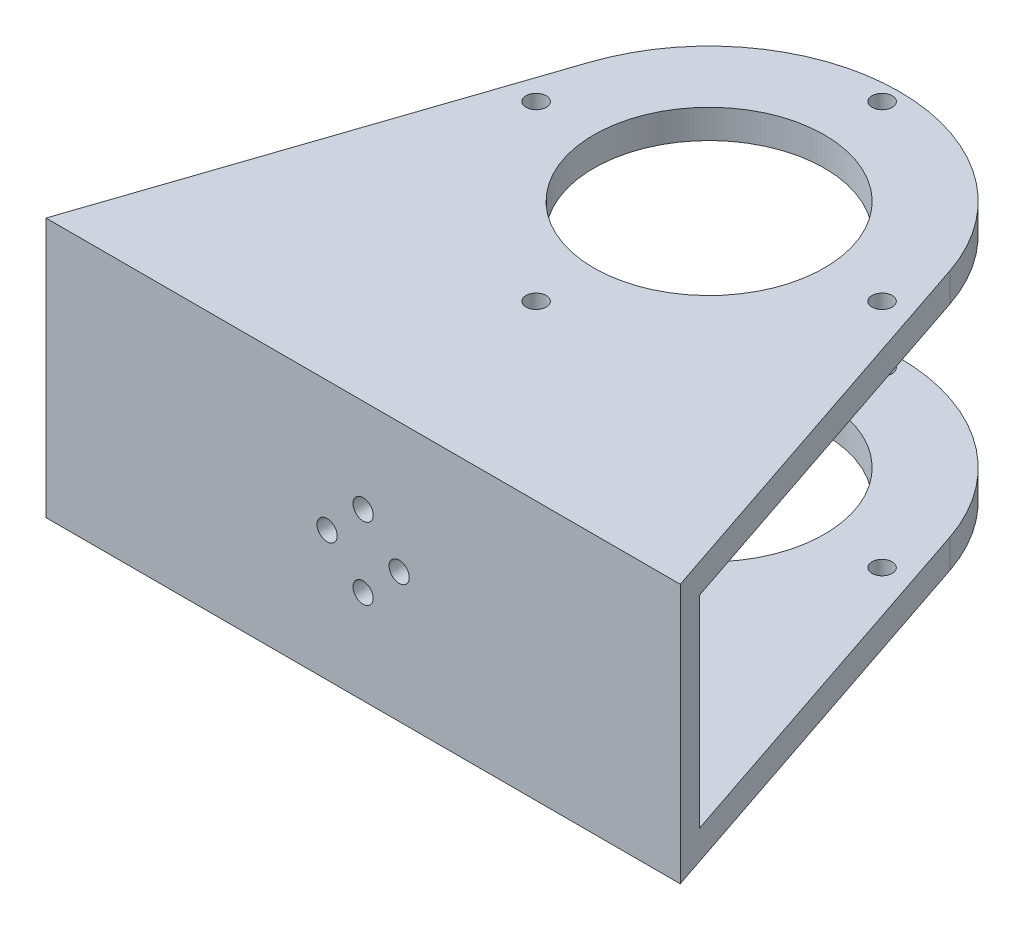
ISO-10303-21;
HEADER;
FILE_DESCRIPTION(('STEP AP214'),'2;1');
FILE_NAME('part.step','',(''),(''),'','','');
FILE_SCHEMA(('AUTOMOTIVE_DESIGN { 1 0 10303 214 1 1 1 1 }'));
ENDSEC;
DATA;
#1=APPLICATION_CONTEXT('core data for automotive mechanical design processes');
#2=APPLICATION_PROTOCOL_DEFINITION('international standard','automotive_design',2000,#1);
#3=PRODUCT_CONTEXT('',#1,'mechanical');
#4=PRODUCT('Part','Part','',(#3));
#5=PRODUCT_RELATED_PRODUCT_CATEGORY('part','',(#4));
#6=PRODUCT_DEFINITION_FORMATION('','',#4);
#7=PRODUCT_DEFINITION_CONTEXT('part definition',#1,'design');
#8=PRODUCT_DEFINITION('design','',#6,#7);
#9=PRODUCT_DEFINITION_SHAPE('','',#8);
#10=(LENGTH_UNIT() NAMED_UNIT(*) SI_UNIT(.MILLI.,.METRE.));
#11=(NAMED_UNIT(*) PLANE_ANGLE_UNIT() SI_UNIT($,.RADIAN.));
#12=(NAMED_UNIT(*) SI_UNIT($,.STERADIAN.) SOLID_ANGLE_UNIT());
#13=UNCERTAINTY_MEASURE_WITH_UNIT(LENGTH_MEASURE(1.E-05),#10,'distance_accuracy_value','');
#14=(GEOMETRIC_REPRESENTATION_CONTEXT(3) GLOBAL_UNCERTAINTY_ASSIGNED_CONTEXT((#13)) GLOBAL_UNIT_ASSIGNED_CONTEXT((#10,
#11,#12)) REPRESENTATION_CONTEXT('',''));
#15=CARTESIAN_POINT('',(0.,0.,0.));
#16=DIRECTION('',(0.,0.,1.));
#17=DIRECTION('',(1.,0.,0.));
#18=AXIS2_PLACEMENT_3D('',#15,#16,#17);
#19=CARTESIAN_POINT('',(0.,57.15,0.));
#20=DIRECTION('',(0.,-1.,0.));
#21=DIRECTION('',(0.,0.,-1.));
#22=AXIS2_PLACEMENT_3D('',#19,#20,#21);
#23=CYLINDRICAL_SURFACE('',#22,41.91);
#24=CARTESIAN_POINT('',(0.,50.8,0.));
#25=DIRECTION('',(0.,-1.,0.));
#26=DIRECTION('',(0.,0.,-1.));
#27=AXIS2_PLACEMENT_3D('',#24,#25,#26);
#28=CIRCLE('',#27,41.91);
#29=CARTESIAN_POINT('',(-39.722823422078,50.8,-13.3620881369049));
#30=VERTEX_POINT('',#29);
#31=CARTESIAN_POINT('',(39.722823422078,50.8,-13.3620881369049));
#32=VERTEX_POINT('',#31);
#33=EDGE_CURVE('E129',#30,#32,#28,.T.);
#34=ORIENTED_EDGE('',*,*,#33,.F.);
#35=DIRECTION('',(0.,-1.,0.));
#36=VECTOR('',#35,1.);
#37=CARTESIAN_POINT('',(-39.722823422078,57.15,-13.3620881369048));
#38=LINE('',#37,#36);
#39=CARTESIAN_POINT('',(-39.722823422078,57.15,-13.3620881369048));
#40=VERTEX_POINT('',#39);
#41=EDGE_CURVE('E11',#40,#30,#38,.T.);
#42=ORIENTED_EDGE('',*,*,#41,.F.);
#43=CARTESIAN_POINT('',(0.,57.15,0.));
#44=DIRECTION('',(0.,1.,0.));
#45=DIRECTION('',(0.,0.,1.));
#46=AXIS2_PLACEMENT_3D('',#43,#44,#45);
#47=CIRCLE('',#46,41.91);
#48=CARTESIAN_POINT('',(39.722823422078,57.15,-13.3620881369048));
#49=VERTEX_POINT('',#48);
#50=EDGE_CURVE('E207',#49,#40,#47,.T.);
#51=ORIENTED_EDGE('',*,*,#50,.F.);
#52=DIRECTION('',(0.,-1.,0.));
#53=VECTOR('',#52,1.);
#54=CARTESIAN_POINT('',(39.722823422078,57.15,-13.3620881369048));
#55=LINE('',#54,#53);
#56=EDGE_CURVE('E66',#49,#32,#55,.T.);
#57=ORIENTED_EDGE('',*,*,#56,.T.);
#58=EDGE_LOOP('',(#34,#42,#51,#57));
#59=FACE_BOUND('',#58,.T.);
#60=ADVANCED_FACE('F40',(#59),#23,.T.);
#61=CARTESIAN_POINT('',(-39.722823422078,57.15,-13.3620881369048));
#62=DIRECTION('',(0.947812536914292,0.,0.318828158838101));
#63=DIRECTION('',(0.318828158838101,0.,-0.947812536914292));
#64=AXIS2_PLACEMENT_3D('',#61,#62,#63);
#65=PLANE('',#64);
#66=DIRECTION('',(-0.318828158838101,0.,0.947812536914292));
#67=VECTOR('',#66,1.);
#68=CARTESIAN_POINT('',(-78.3659397435693,50.8,101.516190646324));
#69=LINE('',#68,#67);
#70=CARTESIAN_POINT('',(-67.7139670506859,50.8,69.85));
#71=VERTEX_POINT('',#70);
#72=EDGE_CURVE('E142',#30,#71,#69,.T.);
#73=ORIENTED_EDGE('',*,*,#72,.T.);
#74=DIRECTION('',(0.,-1.,0.));
#75=VECTOR('',#74,1.);
#76=CARTESIAN_POINT('',(-67.7139670506859,6.35,69.85));
#77=LINE('',#76,#75);
#78=CARTESIAN_POINT('',(-67.7139670506859,6.35,69.85));
#79=VERTEX_POINT('',#78);
#80=EDGE_CURVE('E121',#71,#79,#77,.T.);
#81=ORIENTED_EDGE('',*,*,#80,.T.);
#82=DIRECTION('',(-0.318828158838101,0.,0.947812536914292));
#83=VECTOR('',#82,1.);
#84=CARTESIAN_POINT('',(-78.3659397435693,6.35,101.516190646324));
#85=LINE('',#84,#83);
#86=CARTESIAN_POINT('',(-39.722823422078,6.35,-13.3620881369049));
#87=VERTEX_POINT('',#86);
#88=EDGE_CURVE('E145',#87,#79,#85,.T.);
#89=ORIENTED_EDGE('',*,*,#88,.F.);
#90=CARTESIAN_POINT('',(-39.722823422078,0.,-13.3620881369048));
#91=VERTEX_POINT('',#90);
#92=EDGE_CURVE('E49',#87,#91,#38,.T.);
#93=ORIENTED_EDGE('',*,*,#92,.T.);
#94=DIRECTION('',(-0.318828158838101,0.,0.947812536914292));
#95=VECTOR('',#94,1.);
#96=CARTESIAN_POINT('',(-39.722823422078,0.,-13.3620881369048));
#97=LINE('',#96,#95);
#98=CARTESIAN_POINT('',(-69.85,0.,76.2));
#99=VERTEX_POINT('',#98);
#100=EDGE_CURVE('E216',#91,#99,#97,.T.);
#101=ORIENTED_EDGE('',*,*,#100,.T.);
#102=DIRECTION('',(0.,-1.,0.));
#103=VECTOR('',#102,1.);
#104=CARTESIAN_POINT('',(-69.85,57.15,76.2));
#105=LINE('',#104,#103);
#106=CARTESIAN_POINT('',(-69.85,57.15,76.2));
#107=VERTEX_POINT('',#106);
#108=EDGE_CURVE('E226',#107,#99,#105,.T.);
#109=ORIENTED_EDGE('',*,*,#108,.F.);
#110=DIRECTION('',(-0.318828158838101,0.,0.947812536914292));
#111=VECTOR('',#110,1.);
#112=CARTESIAN_POINT('',(-39.722823422078,57.15,-13.3620881369048));
#113=LINE('',#112,#111);
#114=EDGE_CURVE('E96',#40,#107,#113,.T.);
#115=ORIENTED_EDGE('',*,*,#114,.F.);
#116=ORIENTED_EDGE('',*,*,#41,.T.);
#117=EDGE_LOOP('',(#73,#81,#89,#93,#101,#109,#115,#116));
#118=FACE_BOUND('',#117,.T.);
#119=ADVANCED_FACE('F245',(#118),#65,.F.);
#120=CARTESIAN_POINT('',(39.722823422078,57.15,-13.3620881369048));
#121=DIRECTION('',(0.947812536914292,0.,-0.318828158838101));
#122=DIRECTION('',(-0.318828158838101,0.,-0.947812536914292));
#123=AXIS2_PLACEMENT_3D('',#120,#121,#122);
#124=PLANE('',#123);
#125=DIRECTION('',(0.,1.,0.));
#126=VECTOR('',#125,1.);
#127=CARTESIAN_POINT('',(67.7139670506859,6.35,69.85));
#128=LINE('',#127,#126);
#129=CARTESIAN_POINT('',(67.7139670506859,6.35,69.85));
#130=VERTEX_POINT('',#129);
#131=CARTESIAN_POINT('',(67.7139670506859,50.8,69.85));
#132=VERTEX_POINT('',#131);
#133=EDGE_CURVE('E57',#130,#132,#128,.T.);
#134=ORIENTED_EDGE('',*,*,#133,.T.);
#135=DIRECTION('',(-0.318828158838101,0.,-0.947812536914292));
#136=VECTOR('',#135,1.);
#137=CARTESIAN_POINT('',(78.3659397435693,50.8,101.516190646324));
#138=LINE('',#137,#136);
#139=EDGE_CURVE('E126',#132,#32,#138,.T.);
#140=ORIENTED_EDGE('',*,*,#139,.T.);
#141=ORIENTED_EDGE('',*,*,#56,.F.);
#142=DIRECTION('',(0.318828158838101,0.,0.947812536914292));
#143=VECTOR('',#142,1.);
#144=CARTESIAN_POINT('',(39.722823422078,57.15,-13.3620881369048));
#145=LINE('',#144,#143);
#146=CARTESIAN_POINT('',(69.85,57.15,76.2));
#147=VERTEX_POINT('',#146);
#148=EDGE_CURVE('E213',#49,#147,#145,.T.);
#149=ORIENTED_EDGE('',*,*,#148,.T.);
#150=DIRECTION('',(0.,-1.,0.));
#151=VECTOR('',#150,1.);
#152=CARTESIAN_POINT('',(69.85,57.15,76.2));
#153=LINE('',#152,#151);
#154=CARTESIAN_POINT('',(69.85,0.,76.2));
#155=VERTEX_POINT('',#154);
#156=EDGE_CURVE('E224',#147,#155,#153,.T.);
#157=ORIENTED_EDGE('',*,*,#156,.T.);
#158=DIRECTION('',(0.318828158838101,0.,0.947812536914292));
#159=VECTOR('',#158,1.);
#160=CARTESIAN_POINT('',(39.722823422078,0.,-13.3620881369048));
#161=LINE('',#160,#159);
#162=CARTESIAN_POINT('',(39.722823422078,0.,-13.3620881369048));
#163=VERTEX_POINT('',#162);
#164=EDGE_CURVE('E209',#163,#155,#161,.T.);
#165=ORIENTED_EDGE('',*,*,#164,.F.);
#166=CARTESIAN_POINT('',(39.722823422078,6.35,-13.3620881369049));
#167=VERTEX_POINT('',#166);
#168=EDGE_CURVE('E89',#167,#163,#55,.T.);
#169=ORIENTED_EDGE('',*,*,#168,.F.);
#170=DIRECTION('',(-0.318828158838101,0.,-0.947812536914292));
#171=VECTOR('',#170,1.);
#172=CARTESIAN_POINT('',(78.3659397435693,6.35,101.516190646324));
#173=LINE('',#172,#171);
#174=EDGE_CURVE('E134',#130,#167,#173,.T.);
#175=ORIENTED_EDGE('',*,*,#174,.F.);
#176=EDGE_LOOP('',(#134,#140,#141,#149,#157,#165,#169,#175));
#177=FACE_BOUND('',#176,.T.);
#178=ADVANCED_FACE('F132',(#177),#124,.T.);
#179=CARTESIAN_POINT('',(0.,-71.8420489685532,0.));
#180=DIRECTION('',(0.,1.,0.));
#181=DIRECTION('',(0.,0.,1.));
#182=AXIS2_PLACEMENT_3D('',#179,#180,#181);
#183=CYLINDRICAL_SURFACE('',#182,25.4);
#184=CARTESIAN_POINT('',(0.,57.15,0.));
#185=DIRECTION('',(0.,1.,0.));
#186=DIRECTION('',(0.,0.,1.));
#187=AXIS2_PLACEMENT_3D('',#184,#185,#186);
#188=CIRCLE('',#187,25.4);
#189=CARTESIAN_POINT('',(0.,57.15,25.4));
#190=VERTEX_POINT('',#189);
#191=EDGE_CURVE('E200',#190,#190,#188,.T.);
#192=ORIENTED_EDGE('',*,*,#191,.T.);
#193=EDGE_LOOP('',(#192));
#194=FACE_BOUND('',#193,.T.);
#195=CARTESIAN_POINT('',(0.,50.8,0.));
#196=DIRECTION('',(0.,-1.,0.));
#197=DIRECTION('',(0.,0.,-1.));
#198=AXIS2_PLACEMENT_3D('',#195,#196,#197);
#199=CIRCLE('',#198,25.4);
#200=CARTESIAN_POINT('',(0.,50.8,-25.4));
#201=VERTEX_POINT('',#200);
#202=EDGE_CURVE('E172',#201,#201,#199,.F.);
#203=ORIENTED_EDGE('',*,*,#202,.F.);
#204=EDGE_LOOP('',(#203));
#205=FACE_BOUND('',#204,.T.);
#206=ADVANCED_FACE('F309',(#194,#205),#183,.F.);
#207=CARTESIAN_POINT('',(0.,-6.28617928474841,-38.1));
#208=DIRECTION('',(0.,1.,0.));
#209=DIRECTION('',(0.,0.,1.));
#210=AXIS2_PLACEMENT_3D('',#207,#208,#209);
#211=CYLINDRICAL_SURFACE('',#210,2.2225);
#212=CARTESIAN_POINT('',(0.,57.15,-38.1));
#213=DIRECTION('',(0.,1.,0.));
#214=DIRECTION('',(0.,0.,1.));
#215=AXIS2_PLACEMENT_3D('',#212,#213,#214);
#216=CIRCLE('',#215,2.2225);
#217=CARTESIAN_POINT('',(0.,57.15,-35.8775));
#218=VERTEX_POINT('',#217);
#219=EDGE_CURVE('E184',#218,#218,#216,.T.);
#220=ORIENTED_EDGE('',*,*,#219,.T.);
#221=EDGE_LOOP('',(#220));
#222=FACE_BOUND('',#221,.T.);
#223=CARTESIAN_POINT('',(0.,50.8,-38.1));
#224=DIRECTION('',(0.,-1.,0.));
#225=DIRECTION('',(0.,0.,-1.));
#226=AXIS2_PLACEMENT_3D('',#223,#224,#225);
#227=CIRCLE('',#226,2.2225);
#228=CARTESIAN_POINT('',(0.,50.8,-40.3225));
#229=VERTEX_POINT('',#228);
#230=EDGE_CURVE('E169',#229,#229,#227,.F.);
#231=ORIENTED_EDGE('',*,*,#230,.F.);
#232=EDGE_LOOP('',(#231));
#233=FACE_BOUND('',#232,.T.);
#234=ADVANCED_FACE('F306',(#222,#233),#211,.F.);
#235=CARTESIAN_POINT('',(38.1,-6.28617928474841,-3.9907631702977E-13));
#236=DIRECTION('',(0.,1.,0.));
#237=DIRECTION('',(0.,0.,1.));
#238=AXIS2_PLACEMENT_3D('',#235,#236,#237);
#239=CYLINDRICAL_SURFACE('',#238,2.2225);
#240=CARTESIAN_POINT('',(38.1,57.15,-3.9907631702977E-13));
#241=DIRECTION('',(0.,1.,0.));
#242=DIRECTION('',(-1.,0.,0.));
#243=AXIS2_PLACEMENT_3D('',#240,#241,#242);
#244=CIRCLE('',#243,2.2225);
#245=CARTESIAN_POINT('',(35.8775,57.15,-3.75796865203034E-13));
#246=VERTEX_POINT('',#245);
#247=EDGE_CURVE('E176',#246,#246,#244,.T.);
#248=ORIENTED_EDGE('',*,*,#247,.T.);
#249=EDGE_LOOP('',(#248));
#250=FACE_BOUND('',#249,.T.);
#251=CARTESIAN_POINT('',(38.1,50.8,-3.9907631702977E-13));
#252=DIRECTION('',(0.,-1.,0.));
#253=DIRECTION('',(0.,0.,-1.));
#254=AXIS2_PLACEMENT_3D('',#251,#252,#253);
#255=CIRCLE('',#254,2.2225);
#256=CARTESIAN_POINT('',(38.1,50.8,-2.2225000000004));
#257=VERTEX_POINT('',#256);
#258=EDGE_CURVE('E166',#257,#257,#255,.F.);
#259=ORIENTED_EDGE('',*,*,#258,.F.);
#260=EDGE_LOOP('',(#259));
#261=FACE_BOUND('',#260,.T.);
#262=ADVANCED_FACE('F280',(#250,#261),#239,.F.);
#263=CARTESIAN_POINT('',(0.,-6.28617928474841,38.1));
#264=DIRECTION('',(0.,1.,0.));
#265=DIRECTION('',(0.,0.,1.));
#266=AXIS2_PLACEMENT_3D('',#263,#264,#265);
#267=CYLINDRICAL_SURFACE('',#266,2.2225);
#268=CARTESIAN_POINT('',(0.,57.15,38.1));
#269=DIRECTION('',(0.,1.,0.));
#270=DIRECTION('',(0.,0.,-1.));
#271=AXIS2_PLACEMENT_3D('',#268,#269,#270);
#272=CIRCLE('',#271,2.2225);
#273=CARTESIAN_POINT('',(0.,57.15,35.8775));
#274=VERTEX_POINT('',#273);
#275=EDGE_CURVE('E185',#274,#274,#272,.T.);
#276=ORIENTED_EDGE('',*,*,#275,.T.);
#277=EDGE_LOOP('',(#276));
#278=FACE_BOUND('',#277,.T.);
#279=CARTESIAN_POINT('',(0.,50.8,38.1));
#280=DIRECTION('',(0.,-1.,0.));
#281=DIRECTION('',(0.,0.,-1.));
#282=AXIS2_PLACEMENT_3D('',#279,#280,#281);
#283=CIRCLE('',#282,2.2225);
#284=CARTESIAN_POINT('',(0.,50.8,35.8775));
#285=VERTEX_POINT('',#284);
#286=EDGE_CURVE('E163',#285,#285,#283,.F.);
#287=ORIENTED_EDGE('',*,*,#286,.F.);
#288=EDGE_LOOP('',(#287));
#289=FACE_BOUND('',#288,.T.);
#290=ADVANCED_FACE('F274',(#278,#289),#267,.F.);
#291=CARTESIAN_POINT('',(-38.1,-6.28617928474841,1.33025439009923E-13));
#292=DIRECTION('',(0.,1.,0.));
#293=DIRECTION('',(0.,0.,1.));
#294=AXIS2_PLACEMENT_3D('',#291,#292,#293);
#295=CYLINDRICAL_SURFACE('',#294,2.2225);
#296=CARTESIAN_POINT('',(-38.1,57.15,1.33025439009923E-13));
#297=DIRECTION('',(0.,1.,0.));
#298=DIRECTION('',(1.,0.,0.));
#299=AXIS2_PLACEMENT_3D('',#296,#297,#298);
#300=CIRCLE('',#299,2.2225);
#301=CARTESIAN_POINT('',(-35.8775,57.15,1.25265621734345E-13));
#302=VERTEX_POINT('',#301);
#303=EDGE_CURVE('E177',#302,#302,#300,.T.);
#304=ORIENTED_EDGE('',*,*,#303,.T.);
#305=EDGE_LOOP('',(#304));
#306=FACE_BOUND('',#305,.T.);
#307=CARTESIAN_POINT('',(-38.1,50.8,1.33025439009923E-13));
#308=DIRECTION('',(0.,-1.,0.));
#309=DIRECTION('',(0.,0.,-1.));
#310=AXIS2_PLACEMENT_3D('',#307,#308,#309);
#311=CIRCLE('',#310,2.2225);
#312=CARTESIAN_POINT('',(-38.1,50.8,-2.22249999999987));
#313=VERTEX_POINT('',#312);
#314=EDGE_CURVE('E44',#313,#313,#311,.F.);
#315=ORIENTED_EDGE('',*,*,#314,.F.);
#316=EDGE_LOOP('',(#315));
#317=FACE_BOUND('',#316,.T.);
#318=ADVANCED_FACE('F266',(#306,#317),#295,.F.);
#319=CARTESIAN_POINT('',(0.,6.35,0.));
#320=DIRECTION('',(0.,-1.,0.));
#321=DIRECTION('',(0.,0.,-1.));
#322=AXIS2_PLACEMENT_3D('',#319,#320,#321);
#323=CIRCLE('',#322,41.91);
#324=EDGE_CURVE('E161',#87,#167,#323,.T.);
#325=ORIENTED_EDGE('',*,*,#324,.T.);
#326=ORIENTED_EDGE('',*,*,#168,.T.);
#327=CARTESIAN_POINT('',(0.,0.,0.));
#328=DIRECTION('',(0.,1.,0.));
#329=DIRECTION('',(0.,0.,1.));
#330=AXIS2_PLACEMENT_3D('',#327,#328,#329);
#331=CIRCLE('',#330,41.91);
#332=EDGE_CURVE('E206',#163,#91,#331,.T.);
#333=ORIENTED_EDGE('',*,*,#332,.T.);
#334=ORIENTED_EDGE('',*,*,#92,.F.);
#335=EDGE_LOOP('',(#325,#326,#333,#334));
#336=FACE_BOUND('',#335,.T.);
#337=ADVANCED_FACE('F42',(#336),#23,.T.);
#338=CARTESIAN_POINT('',(-69.85,57.15,76.2));
#339=DIRECTION('',(0.,0.,-1.));
#340=DIRECTION('',(-1.,0.,0.));
#341=AXIS2_PLACEMENT_3D('',#338,#339,#340);
#342=PLANE('',#341);
#343=CARTESIAN_POINT('',(0.,36.5125,76.2));
#344=DIRECTION('',(0.,0.,1.));
#345=DIRECTION('',(1.,0.,0.));
#346=AXIS2_PLACEMENT_3D('',#343,#344,#345);
#347=CIRCLE('',#346,2.2225);
#348=CARTESIAN_POINT('',(2.2225,36.5125,76.2));
#349=VERTEX_POINT('',#348);
#350=EDGE_CURVE('E493',#349,#349,#347,.T.);
#351=ORIENTED_EDGE('',*,*,#350,.F.);
#352=EDGE_LOOP('',(#351));
#353=FACE_BOUND('',#352,.T.);
#354=CARTESIAN_POINT('',(-7.9375,28.575,76.2));
#355=DIRECTION('',(0.,0.,1.));
#356=DIRECTION('',(1.,0.,0.));
#357=AXIS2_PLACEMENT_3D('',#354,#355,#356);
#358=CIRCLE('',#357,2.2225);
#359=CARTESIAN_POINT('',(-5.715,28.575,76.2));
#360=VERTEX_POINT('',#359);
#361=EDGE_CURVE('E500',#360,#360,#358,.T.);
#362=ORIENTED_EDGE('',*,*,#361,.F.);
#363=EDGE_LOOP('',(#362));
#364=FACE_BOUND('',#363,.T.);
#365=CARTESIAN_POINT('',(0.,20.6375,76.2));
#366=DIRECTION('',(0.,0.,1.));
#367=DIRECTION('',(1.,0.,0.));
#368=AXIS2_PLACEMENT_3D('',#365,#366,#367);
#369=CIRCLE('',#368,2.2225);
#370=CARTESIAN_POINT('',(2.2225,20.6375,76.2));
#371=VERTEX_POINT('',#370);
#372=EDGE_CURVE('E506',#371,#371,#369,.T.);
#373=ORIENTED_EDGE('',*,*,#372,.F.);
#374=EDGE_LOOP('',(#373));
#375=FACE_BOUND('',#374,.T.);
#376=CARTESIAN_POINT('',(7.9375,28.575,76.2));
#377=DIRECTION('',(0.,0.,1.));
#378=DIRECTION('',(1.,0.,0.));
#379=AXIS2_PLACEMENT_3D('',#376,#377,#378);
#380=CIRCLE('',#379,2.2225);
#381=CARTESIAN_POINT('',(10.16,28.575,76.2));
#382=VERTEX_POINT('',#381);
#383=EDGE_CURVE('E510',#382,#382,#380,.T.);
#384=ORIENTED_EDGE('',*,*,#383,.F.);
#385=EDGE_LOOP('',(#384));
#386=FACE_BOUND('',#385,.T.);
#387=DIRECTION('',(1.,0.,0.));
#388=VECTOR('',#387,1.);
#389=CARTESIAN_POINT('',(-69.85,0.,76.2));
#390=LINE('',#389,#388);
#391=EDGE_CURVE('E218',#99,#155,#390,.T.);
#392=ORIENTED_EDGE('',*,*,#391,.T.);
#393=ORIENTED_EDGE('',*,*,#156,.F.);
#394=DIRECTION('',(1.,0.,0.));
#395=VECTOR('',#394,1.);
#396=CARTESIAN_POINT('',(-69.85,57.15,76.2));
#397=LINE('',#396,#395);
#398=EDGE_CURVE('E211',#107,#147,#397,.T.);
#399=ORIENTED_EDGE('',*,*,#398,.F.);
#400=ORIENTED_EDGE('',*,*,#108,.T.);
#401=EDGE_LOOP('',(#392,#393,#399,#400));
#402=FACE_BOUND('',#401,.T.);
#403=ADVANCED_FACE('F255',(#353,#364,#375,#386,#402),#342,.F.);
#404=CARTESIAN_POINT('',(0.,57.15,0.));
#405=DIRECTION('',(0.,1.,0.));
#406=DIRECTION('',(0.,0.,1.));
#407=AXIS2_PLACEMENT_3D('',#404,#405,#406);
#408=PLANE('',#407);
#409=ORIENTED_EDGE('',*,*,#303,.F.);
#410=EDGE_LOOP('',(#409));
#411=FACE_BOUND('',#410,.T.);
#412=ORIENTED_EDGE('',*,*,#275,.F.);
#413=EDGE_LOOP('',(#412));
#414=FACE_BOUND('',#413,.T.);
#415=ORIENTED_EDGE('',*,*,#247,.F.);
#416=EDGE_LOOP('',(#415));
#417=FACE_BOUND('',#416,.T.);
#418=ORIENTED_EDGE('',*,*,#219,.F.);
#419=EDGE_LOOP('',(#418));
#420=FACE_BOUND('',#419,.T.);
#421=ORIENTED_EDGE('',*,*,#191,.F.);
#422=EDGE_LOOP('',(#421));
#423=FACE_BOUND('',#422,.T.);
#424=ORIENTED_EDGE('',*,*,#50,.T.);
#425=ORIENTED_EDGE('',*,*,#114,.T.);
#426=ORIENTED_EDGE('',*,*,#398,.T.);
#427=ORIENTED_EDGE('',*,*,#148,.F.);
#428=EDGE_LOOP('',(#424,#425,#426,#427));
#429=FACE_BOUND('',#428,.T.);
#430=ADVANCED_FACE('F257',(#411,#414,#417,#420,#423,#429),#408,.T.);
#431=CARTESIAN_POINT('',(0.,0.,0.));
#432=DIRECTION('',(0.,1.,0.));
#433=DIRECTION('',(0.,0.,1.));
#434=AXIS2_PLACEMENT_3D('',#431,#432,#433);
#435=PLANE('',#434);
#436=CARTESIAN_POINT('',(-38.1,0.,1.33025439009923E-13));
#437=DIRECTION('',(0.,1.,0.));
#438=DIRECTION('',(0.,0.,1.));
#439=AXIS2_PLACEMENT_3D('',#436,#437,#438);
#440=CIRCLE('',#439,2.2225);
#441=CARTESIAN_POINT('',(-38.1,0.,2.22250000000013));
#442=VERTEX_POINT('',#441);
#443=EDGE_CURVE('E180',#442,#442,#440,.F.);
#444=ORIENTED_EDGE('',*,*,#443,.F.);
#445=EDGE_LOOP('',(#444));
#446=FACE_BOUND('',#445,.T.);
#447=CARTESIAN_POINT('',(0.,0.,38.1));
#448=DIRECTION('',(0.,1.,0.));
#449=DIRECTION('',(0.,0.,1.));
#450=AXIS2_PLACEMENT_3D('',#447,#448,#449);
#451=CIRCLE('',#450,2.2225);
#452=CARTESIAN_POINT('',(0.,0.,40.3225));
#453=VERTEX_POINT('',#452);
#454=EDGE_CURVE('E181',#453,#453,#451,.F.);
#455=ORIENTED_EDGE('',*,*,#454,.F.);
#456=EDGE_LOOP('',(#455));
#457=FACE_BOUND('',#456,.T.);
#458=CARTESIAN_POINT('',(38.1,0.,-3.9907631702977E-13));
#459=DIRECTION('',(0.,1.,0.));
#460=DIRECTION('',(0.,0.,1.));
#461=AXIS2_PLACEMENT_3D('',#458,#459,#460);
#462=CIRCLE('',#461,2.2225);
#463=CARTESIAN_POINT('',(38.1,0.,2.2224999999996));
#464=VERTEX_POINT('',#463);
#465=EDGE_CURVE('E188',#464,#464,#462,.F.);
#466=ORIENTED_EDGE('',*,*,#465,.F.);
#467=EDGE_LOOP('',(#466));
#468=FACE_BOUND('',#467,.T.);
#469=CARTESIAN_POINT('',(0.,0.,-38.1));
#470=DIRECTION('',(0.,1.,0.));
#471=DIRECTION('',(0.,0.,1.));
#472=AXIS2_PLACEMENT_3D('',#469,#470,#471);
#473=CIRCLE('',#472,2.2225);
#474=CARTESIAN_POINT('',(0.,0.,-35.8775));
#475=VERTEX_POINT('',#474);
#476=EDGE_CURVE('E197',#475,#475,#473,.F.);
#477=ORIENTED_EDGE('',*,*,#476,.F.);
#478=EDGE_LOOP('',(#477));
#479=FACE_BOUND('',#478,.T.);
#480=CARTESIAN_POINT('',(0.,0.,0.));
#481=DIRECTION('',(0.,1.,0.));
#482=DIRECTION('',(0.,0.,1.));
#483=AXIS2_PLACEMENT_3D('',#480,#481,#482);
#484=CIRCLE('',#483,25.4);
#485=CARTESIAN_POINT('',(0.,0.,25.4));
#486=VERTEX_POINT('',#485);
#487=EDGE_CURVE('E203',#486,#486,#484,.F.);
#488=ORIENTED_EDGE('',*,*,#487,.F.);
#489=EDGE_LOOP('',(#488));
#490=FACE_BOUND('',#489,.T.);
#491=ORIENTED_EDGE('',*,*,#332,.F.);
#492=ORIENTED_EDGE('',*,*,#164,.T.);
#493=ORIENTED_EDGE('',*,*,#391,.F.);
#494=ORIENTED_EDGE('',*,*,#100,.F.);
#495=EDGE_LOOP('',(#491,#492,#493,#494));
#496=FACE_BOUND('',#495,.T.);
#497=ADVANCED_FACE('F249',(#446,#457,#468,#479,#490,#496),#435,.F.);
#498=CARTESIAN_POINT('',(0.,6.34999999999999,0.));
#499=DIRECTION('',(0.,-1.,0.));
#500=DIRECTION('',(0.,0.,-1.));
#501=AXIS2_PLACEMENT_3D('',#498,#499,#500);
#502=CIRCLE('',#501,25.4);
#503=CARTESIAN_POINT('',(0.,6.34999999999999,-25.4));
#504=VERTEX_POINT('',#503);
#505=EDGE_CURVE('E158',#504,#504,#502,.F.);
#506=ORIENTED_EDGE('',*,*,#505,.T.);
#507=EDGE_LOOP('',(#506));
#508=FACE_BOUND('',#507,.T.);
#509=ORIENTED_EDGE('',*,*,#487,.T.);
#510=EDGE_LOOP('',(#509));
#511=FACE_BOUND('',#510,.T.);
#512=ADVANCED_FACE('F304',(#508,#511),#183,.F.);
#513=CARTESIAN_POINT('',(0.,6.35,-38.1));
#514=DIRECTION('',(0.,-1.,0.));
#515=DIRECTION('',(0.,0.,-1.));
#516=AXIS2_PLACEMENT_3D('',#513,#514,#515);
#517=CIRCLE('',#516,2.2225);
#518=CARTESIAN_POINT('',(0.,6.35,-40.3225));
#519=VERTEX_POINT('',#518);
#520=EDGE_CURVE('E155',#519,#519,#517,.F.);
#521=ORIENTED_EDGE('',*,*,#520,.T.);
#522=EDGE_LOOP('',(#521));
#523=FACE_BOUND('',#522,.T.);
#524=ORIENTED_EDGE('',*,*,#476,.T.);
#525=EDGE_LOOP('',(#524));
#526=FACE_BOUND('',#525,.T.);
#527=ADVANCED_FACE('F297',(#523,#526),#211,.F.);
#528=CARTESIAN_POINT('',(38.1,6.35,-3.9907631702977E-13));
#529=DIRECTION('',(0.,-1.,0.));
#530=DIRECTION('',(0.,0.,-1.));
#531=AXIS2_PLACEMENT_3D('',#528,#529,#530);
#532=CIRCLE('',#531,2.2225);
#533=CARTESIAN_POINT('',(38.1,6.35,-2.2225000000004));
#534=VERTEX_POINT('',#533);
#535=EDGE_CURVE('E152',#534,#534,#532,.F.);
#536=ORIENTED_EDGE('',*,*,#535,.T.);
#537=EDGE_LOOP('',(#536));
#538=FACE_BOUND('',#537,.T.);
#539=ORIENTED_EDGE('',*,*,#465,.T.);
#540=EDGE_LOOP('',(#539));
#541=FACE_BOUND('',#540,.T.);
#542=ADVANCED_FACE('F292',(#538,#541),#239,.F.);
#543=CARTESIAN_POINT('',(0.,6.35,38.1));
#544=DIRECTION('',(0.,-1.,0.));
#545=DIRECTION('',(0.,0.,-1.));
#546=AXIS2_PLACEMENT_3D('',#543,#544,#545);
#547=CIRCLE('',#546,2.2225);
#548=CARTESIAN_POINT('',(0.,6.35,35.8775));
#549=VERTEX_POINT('',#548);
#550=EDGE_CURVE('E149',#549,#549,#547,.F.);
#551=ORIENTED_EDGE('',*,*,#550,.T.);
#552=EDGE_LOOP('',(#551));
#553=FACE_BOUND('',#552,.T.);
#554=ORIENTED_EDGE('',*,*,#454,.T.);
#555=EDGE_LOOP('',(#554));
#556=FACE_BOUND('',#555,.T.);
#557=ADVANCED_FACE('F283',(#553,#556),#267,.F.);
#558=CARTESIAN_POINT('',(-38.1,6.35,1.33025439009923E-13));
#559=DIRECTION('',(0.,-1.,0.));
#560=DIRECTION('',(0.,0.,-1.));
#561=AXIS2_PLACEMENT_3D('',#558,#559,#560);
#562=CIRCLE('',#561,2.2225);
#563=CARTESIAN_POINT('',(-38.1,6.35,-2.22249999999987));
#564=VERTEX_POINT('',#563);
#565=EDGE_CURVE('E147',#564,#564,#562,.F.);
#566=ORIENTED_EDGE('',*,*,#565,.T.);
#567=EDGE_LOOP('',(#566));
#568=FACE_BOUND('',#567,.T.);
#569=ORIENTED_EDGE('',*,*,#443,.T.);
#570=EDGE_LOOP('',(#569));
#571=FACE_BOUND('',#570,.T.);
#572=ADVANCED_FACE('F231',(#568,#571),#295,.F.);
#573=CARTESIAN_POINT('',(-172.503209802405,50.8,69.85));
#574=DIRECTION('',(0.,-1.,0.));
#575=DIRECTION('',(0.,0.,-1.));
#576=AXIS2_PLACEMENT_3D('',#573,#574,#575);
#577=PLANE('',#576);
#578=ORIENTED_EDGE('',*,*,#314,.T.);
#579=EDGE_LOOP('',(#578));
#580=FACE_BOUND('',#579,.T.);
#581=ORIENTED_EDGE('',*,*,#286,.T.);
#582=EDGE_LOOP('',(#581));
#583=FACE_BOUND('',#582,.T.);
#584=ORIENTED_EDGE('',*,*,#258,.T.);
#585=EDGE_LOOP('',(#584));
#586=FACE_BOUND('',#585,.T.);
#587=ORIENTED_EDGE('',*,*,#230,.T.);
#588=EDGE_LOOP('',(#587));
#589=FACE_BOUND('',#588,.T.);
#590=ORIENTED_EDGE('',*,*,#202,.T.);
#591=EDGE_LOOP('',(#590));
#592=FACE_BOUND('',#591,.T.);
#593=ORIENTED_EDGE('',*,*,#33,.T.);
#594=ORIENTED_EDGE('',*,*,#139,.F.);
#595=DIRECTION('',(1.,0.,0.));
#596=VECTOR('',#595,1.);
#597=CARTESIAN_POINT('',(-172.503209802405,50.8,69.85));
#598=LINE('',#597,#596);
#599=EDGE_CURVE('E117',#71,#132,#598,.T.);
#600=ORIENTED_EDGE('',*,*,#599,.F.);
#601=ORIENTED_EDGE('',*,*,#72,.F.);
#602=EDGE_LOOP('',(#593,#594,#600,#601));
#603=FACE_BOUND('',#602,.T.);
#604=ADVANCED_FACE('F128',(#580,#583,#586,#589,#592,#603),#577,.T.);
#605=CARTESIAN_POINT('',(-172.503209802405,6.35,69.85));
#606=DIRECTION('',(0.,-1.,0.));
#607=DIRECTION('',(0.,0.,-1.));
#608=AXIS2_PLACEMENT_3D('',#605,#606,#607);
#609=PLANE('',#608);
#610=ORIENTED_EDGE('',*,*,#520,.F.);
#611=EDGE_LOOP('',(#610));
#612=FACE_BOUND('',#611,.T.);
#613=ORIENTED_EDGE('',*,*,#550,.F.);
#614=EDGE_LOOP('',(#613));
#615=FACE_BOUND('',#614,.T.);
#616=ORIENTED_EDGE('',*,*,#565,.F.);
#617=EDGE_LOOP('',(#616));
#618=FACE_BOUND('',#617,.T.);
#619=ORIENTED_EDGE('',*,*,#535,.F.);
#620=EDGE_LOOP('',(#619));
#621=FACE_BOUND('',#620,.T.);
#622=ORIENTED_EDGE('',*,*,#505,.F.);
#623=EDGE_LOOP('',(#622));
#624=FACE_BOUND('',#623,.T.);
#625=ORIENTED_EDGE('',*,*,#324,.F.);
#626=ORIENTED_EDGE('',*,*,#88,.T.);
#627=DIRECTION('',(1.,0.,0.));
#628=VECTOR('',#627,1.);
#629=CARTESIAN_POINT('',(-172.503209802405,6.35,69.85));
#630=LINE('',#629,#628);
#631=EDGE_CURVE('E125',#79,#130,#630,.T.);
#632=ORIENTED_EDGE('',*,*,#631,.T.);
#633=ORIENTED_EDGE('',*,*,#174,.T.);
#634=EDGE_LOOP('',(#625,#626,#632,#633));
#635=FACE_BOUND('',#634,.T.);
#636=ADVANCED_FACE('F234',(#612,#615,#618,#621,#624,#635),#609,.F.);
#637=CARTESIAN_POINT('',(-172.503209802405,6.35,69.85));
#638=DIRECTION('',(0.,0.,-1.));
#639=DIRECTION('',(-1.,0.,0.));
#640=AXIS2_PLACEMENT_3D('',#637,#638,#639);
#641=PLANE('',#640);
#642=CARTESIAN_POINT('',(0.,36.5125,69.85));
#643=DIRECTION('',(0.,0.,-1.));
#644=DIRECTION('',(-1.,0.,0.));
#645=AXIS2_PLACEMENT_3D('',#642,#643,#644);
#646=CIRCLE('',#645,2.2225);
#647=CARTESIAN_POINT('',(-2.2225,36.5125,69.85));
#648=VERTEX_POINT('',#647);
#649=EDGE_CURVE('E136',#648,#648,#646,.F.);
#650=ORIENTED_EDGE('',*,*,#649,.T.);
#651=EDGE_LOOP('',(#650));
#652=FACE_BOUND('',#651,.T.);
#653=CARTESIAN_POINT('',(-7.9375,28.575,69.85));
#654=DIRECTION('',(0.,0.,-1.));
#655=DIRECTION('',(-1.,0.,0.));
#656=AXIS2_PLACEMENT_3D('',#653,#654,#655);
#657=CIRCLE('',#656,2.2225);
#658=CARTESIAN_POINT('',(-10.16,28.575,69.85));
#659=VERTEX_POINT('',#658);
#660=EDGE_CURVE('E497',#659,#659,#657,.F.);
#661=ORIENTED_EDGE('',*,*,#660,.T.);
#662=EDGE_LOOP('',(#661));
#663=FACE_BOUND('',#662,.T.);
#664=CARTESIAN_POINT('',(0.,20.6375,69.85));
#665=DIRECTION('',(0.,0.,-1.));
#666=DIRECTION('',(-1.,0.,0.));
#667=AXIS2_PLACEMENT_3D('',#664,#665,#666);
#668=CIRCLE('',#667,2.2225);
#669=CARTESIAN_POINT('',(-2.2225,20.6375,69.85));
#670=VERTEX_POINT('',#669);
#671=EDGE_CURVE('E503',#670,#670,#668,.F.);
#672=ORIENTED_EDGE('',*,*,#671,.T.);
#673=EDGE_LOOP('',(#672));
#674=FACE_BOUND('',#673,.T.);
#675=CARTESIAN_POINT('',(7.9375,28.575,69.85));
#676=DIRECTION('',(0.,0.,-1.));
#677=DIRECTION('',(-1.,0.,0.));
#678=AXIS2_PLACEMENT_3D('',#675,#676,#677);
#679=CIRCLE('',#678,2.2225);
#680=CARTESIAN_POINT('',(5.715,28.575,69.85));
#681=VERTEX_POINT('',#680);
#682=EDGE_CURVE('E139',#681,#681,#679,.F.);
#683=ORIENTED_EDGE('',*,*,#682,.T.);
#684=EDGE_LOOP('',(#683));
#685=FACE_BOUND('',#684,.T.);
#686=ORIENTED_EDGE('',*,*,#599,.T.);
#687=ORIENTED_EDGE('',*,*,#133,.F.);
#688=ORIENTED_EDGE('',*,*,#631,.F.);
#689=ORIENTED_EDGE('',*,*,#80,.F.);
#690=EDGE_LOOP('',(#686,#687,#688,#689));
#691=FACE_BOUND('',#690,.T.);
#692=ADVANCED_FACE('F119',(#652,#663,#674,#685,#691),#641,.T.);
#693=CARTESIAN_POINT('',(7.9375,28.575,63.5638207152516));
#694=DIRECTION('',(0.,0.,1.));
#695=DIRECTION('',(1.,0.,0.));
#696=AXIS2_PLACEMENT_3D('',#693,#694,#695);
#697=CYLINDRICAL_SURFACE('',#696,2.2225);
#698=ORIENTED_EDGE('',*,*,#383,.T.);
#699=EDGE_LOOP('',(#698));
#700=FACE_BOUND('',#699,.T.);
#701=ORIENTED_EDGE('',*,*,#682,.F.);
#702=EDGE_LOOP('',(#701));
#703=FACE_BOUND('',#702,.T.);
#704=ADVANCED_FACE('F412',(#700,#703),#697,.F.);
#705=CARTESIAN_POINT('',(0.,20.6375,63.5638207152516));
#706=DIRECTION('',(0.,0.,1.));
#707=DIRECTION('',(1.,0.,0.));
#708=AXIS2_PLACEMENT_3D('',#705,#706,#707);
#709=CYLINDRICAL_SURFACE('',#708,2.2225);
#710=ORIENTED_EDGE('',*,*,#372,.T.);
#711=EDGE_LOOP('',(#710));
#712=FACE_BOUND('',#711,.T.);
#713=ORIENTED_EDGE('',*,*,#671,.F.);
#714=EDGE_LOOP('',(#713));
#715=FACE_BOUND('',#714,.T.);
#716=ADVANCED_FACE('F421',(#712,#715),#709,.F.);
#717=CARTESIAN_POINT('',(-7.9375,28.575,63.5638207152516));
#718=DIRECTION('',(0.,0.,1.));
#719=DIRECTION('',(1.,0.,0.));
#720=AXIS2_PLACEMENT_3D('',#717,#718,#719);
#721=CYLINDRICAL_SURFACE('',#720,2.2225);
#722=ORIENTED_EDGE('',*,*,#361,.T.);
#723=EDGE_LOOP('',(#722));
#724=FACE_BOUND('',#723,.T.);
#725=ORIENTED_EDGE('',*,*,#660,.F.);
#726=EDGE_LOOP('',(#725));
#727=FACE_BOUND('',#726,.T.);
#728=ADVANCED_FACE('F430',(#724,#727),#721,.F.);
#729=CARTESIAN_POINT('',(0.,36.5125,63.5638207152516));
#730=DIRECTION('',(0.,0.,1.));
#731=DIRECTION('',(1.,0.,0.));
#732=AXIS2_PLACEMENT_3D('',#729,#730,#731);
#733=CYLINDRICAL_SURFACE('',#732,2.2225);
#734=ORIENTED_EDGE('',*,*,#350,.T.);
#735=EDGE_LOOP('',(#734));
#736=FACE_BOUND('',#735,.T.);
#737=ORIENTED_EDGE('',*,*,#649,.F.);
#738=EDGE_LOOP('',(#737));
#739=FACE_BOUND('',#738,.T.);
#740=ADVANCED_FACE('F439',(#736,#739),#733,.F.);
#741=CLOSED_SHELL('',(#60,#119,#178,#206,#234,#262,#290,#318,#337,#403,#430,#497,#512,#527,#542,
#557,#572,#604,#636,#692,#704,#716,#728,#740));
#742=MANIFOLD_SOLID_BREP('B2',#741);
#743=ADVANCED_BREP_SHAPE_REPRESENTATION('',(#18,#742),#14);
#744=SHAPE_DEFINITION_REPRESENTATION(#9,#743);
ENDSEC;
END-ISO-10303-21;
